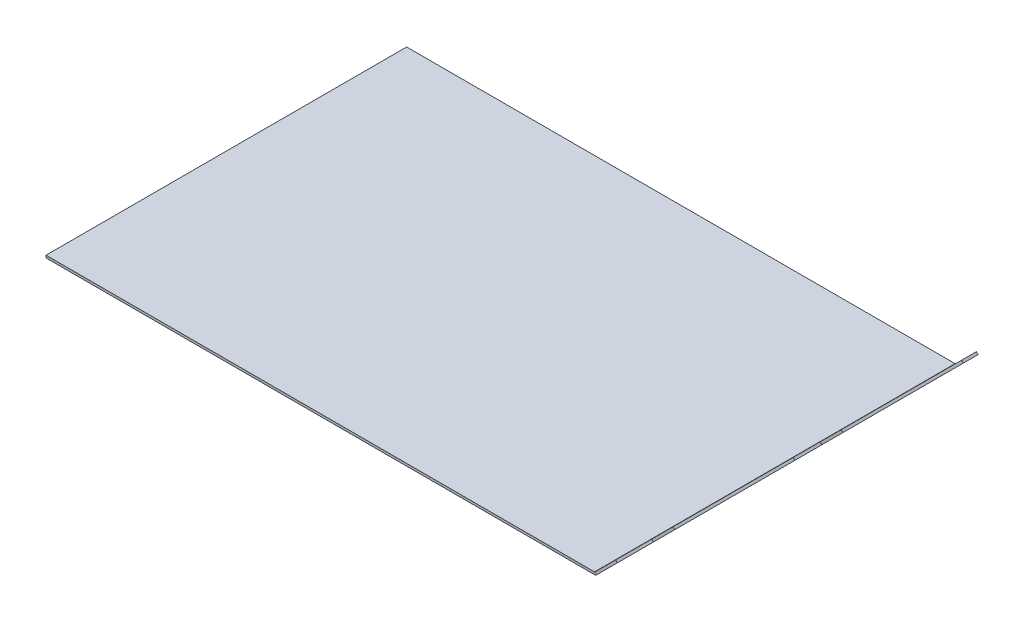
ISO-10303-21;
HEADER;
FILE_DESCRIPTION(('STEP AP214'),'2;1');
FILE_NAME('part.step','',(''),(''),'','','');
FILE_SCHEMA(('AUTOMOTIVE_DESIGN { 1 0 10303 214 1 1 1 1 }'));
ENDSEC;
DATA;
#1=APPLICATION_CONTEXT('core data for automotive mechanical design processes');
#2=APPLICATION_PROTOCOL_DEFINITION('international standard','automotive_design',2000,#1);
#3=PRODUCT_CONTEXT('',#1,'mechanical');
#4=PRODUCT('Part','Part','',(#3));
#5=PRODUCT_RELATED_PRODUCT_CATEGORY('part','',(#4));
#6=PRODUCT_DEFINITION_FORMATION('','',#4);
#7=PRODUCT_DEFINITION_CONTEXT('part definition',#1,'design');
#8=PRODUCT_DEFINITION('design','',#6,#7);
#9=PRODUCT_DEFINITION_SHAPE('','',#8);
#10=(LENGTH_UNIT() NAMED_UNIT(*) SI_UNIT(.MILLI.,.METRE.));
#11=(NAMED_UNIT(*) PLANE_ANGLE_UNIT() SI_UNIT($,.RADIAN.));
#12=(NAMED_UNIT(*) SI_UNIT($,.STERADIAN.) SOLID_ANGLE_UNIT());
#13=UNCERTAINTY_MEASURE_WITH_UNIT(LENGTH_MEASURE(1.E-05),#10,'distance_accuracy_value','');
#14=(GEOMETRIC_REPRESENTATION_CONTEXT(3) GLOBAL_UNCERTAINTY_ASSIGNED_CONTEXT((#13)) GLOBAL_UNIT_ASSIGNED_CONTEXT((#10,
#11,#12)) REPRESENTATION_CONTEXT('',''));
#15=CARTESIAN_POINT('',(0.,0.,0.));
#16=DIRECTION('',(0.,0.,1.));
#17=DIRECTION('',(1.,0.,0.));
#18=AXIS2_PLACEMENT_3D('',#15,#16,#17);
#19=CARTESIAN_POINT('',(239.55088437879,33.674651235032,-150.));
#20=DIRECTION('',(0.707106781186546,0.707106781186549,0.));
#21=DIRECTION('',(0.,0.,-1.));
#22=AXIS2_PLACEMENT_3D('',#19,#20,#21);
#23=PLANE('',#22);
#24=DIRECTION('',(-0.707106781186549,0.707106781186546,0.));
#25=VECTOR('',#24,1.);
#26=CARTESIAN_POINT('',(257.388209996306,15.837325617516,120.));
#27=LINE('',#26,#25);
#28=CARTESIAN_POINT('',(239.55088437879,33.674651235032,120.));
#29=VERTEX_POINT('',#28);
#30=CARTESIAN_POINT('',(238.136670816417,35.0888647974051,120.));
#31=VERTEX_POINT('',#30);
#32=EDGE_CURVE('E163',#29,#31,#27,.T.);
#33=ORIENTED_EDGE('',*,*,#32,.F.);
#34=DIRECTION('',(0.,0.,-1.));
#35=VECTOR('',#34,1.);
#36=CARTESIAN_POINT('',(239.55088437879,33.674651235032,-150.));
#37=LINE('',#36,#35);
#38=CARTESIAN_POINT('',(239.55088437879,33.674651235032,20.));
#39=VERTEX_POINT('',#38);
#40=EDGE_CURVE('E207',#29,#39,#37,.T.);
#41=ORIENTED_EDGE('',*,*,#40,.T.);
#42=DIRECTION('',(-0.707106781186549,0.707106781186546,0.));
#43=VECTOR('',#42,1.);
#44=CARTESIAN_POINT('',(257.388209996306,15.8373256175161,20.));
#45=LINE('',#44,#43);
#46=CARTESIAN_POINT('',(238.136670816417,35.0888647974051,20.));
#47=VERTEX_POINT('',#46);
#48=EDGE_CURVE('E248',#39,#47,#45,.T.);
#49=ORIENTED_EDGE('',*,*,#48,.T.);
#50=DIRECTION('',(0.,0.,-1.));
#51=VECTOR('',#50,1.);
#52=CARTESIAN_POINT('',(238.136670816417,35.0888647974051,-150.));
#53=LINE('',#52,#51);
#54=EDGE_CURVE('E180',#31,#47,#53,.T.);
#55=ORIENTED_EDGE('',*,*,#54,.F.);
#56=EDGE_LOOP('',(#33,#41,#49,#55));
#57=FACE_BOUND('',#56,.T.);
#58=ADVANCED_FACE('F43',(#57),#23,.T.);
#59=CARTESIAN_POINT('',(58.9383769540735,-144.109429064939,0.));
#60=DIRECTION('',(0.707106781186549,-0.707106781186546,0.));
#61=DIRECTION('',(0.,0.,-1.));
#62=AXIS2_PLACEMENT_3D('',#59,#60,#61);
#63=PLANE('',#62);
#64=DIRECTION('',(0.,0.,1.));
#65=VECTOR('',#64,1.);
#66=CARTESIAN_POINT('',(220.459001286754,17.4111952677413,150.));
#67=LINE('',#66,#65);
#68=CARTESIAN_POINT('',(220.459001286754,17.4111952677413,120.));
#69=VERTEX_POINT('',#68);
#70=CARTESIAN_POINT('',(220.459001286754,17.4111952677413,150.));
#71=VERTEX_POINT('',#70);
#72=EDGE_CURVE('E238',#69,#71,#67,.T.);
#73=ORIENTED_EDGE('',*,*,#72,.F.);
#74=DIRECTION('',(-0.707106781186547,-0.707106781186548,0.));
#75=VECTOR('',#74,1.);
#76=CARTESIAN_POINT('',(238.136670816417,35.0888647974051,120.));
#77=LINE('',#76,#75);
#78=EDGE_CURVE('E237',#31,#69,#77,.T.);
#79=ORIENTED_EDGE('',*,*,#78,.F.);
#80=ORIENTED_EDGE('',*,*,#54,.T.);
#81=DIRECTION('',(0.707106781186546,0.707106781186549,0.));
#82=VECTOR('',#81,1.);
#83=CARTESIAN_POINT('',(238.136670816417,35.0888647974051,20.));
#84=LINE('',#83,#82);
#85=CARTESIAN_POINT('',(220.459001286754,17.4111952677413,20.));
#86=VERTEX_POINT('',#85);
#87=EDGE_CURVE('E258',#86,#47,#84,.T.);
#88=ORIENTED_EDGE('',*,*,#87,.F.);
#89=DIRECTION('',(0.,0.,1.));
#90=VECTOR('',#89,1.);
#91=CARTESIAN_POINT('',(220.459001286754,17.4111952677413,-20.));
#92=LINE('',#91,#90);
#93=CARTESIAN_POINT('',(220.459001286754,17.4111952677413,-20.));
#94=VERTEX_POINT('',#93);
#95=EDGE_CURVE('E255',#94,#86,#92,.T.);
#96=ORIENTED_EDGE('',*,*,#95,.F.);
#97=DIRECTION('',(-0.707106781186546,-0.707106781186549,0.));
#98=VECTOR('',#97,1.);
#99=CARTESIAN_POINT('',(238.136670816417,35.0888647974051,-20.));
#100=LINE('',#99,#98);
#101=CARTESIAN_POINT('',(238.136670816417,35.0888647974051,-20.));
#102=VERTEX_POINT('',#101);
#103=EDGE_CURVE('E179',#102,#94,#100,.T.);
#104=ORIENTED_EDGE('',*,*,#103,.F.);
#105=CARTESIAN_POINT('',(238.136670816417,35.0888647974051,-120.));
#106=VERTEX_POINT('',#105);
#107=EDGE_CURVE('E170',#102,#106,#53,.T.);
#108=ORIENTED_EDGE('',*,*,#107,.T.);
#109=DIRECTION('',(0.707106781186546,0.707106781186549,0.));
#110=VECTOR('',#109,1.);
#111=CARTESIAN_POINT('',(238.136670816417,35.0888647974051,-120.));
#112=LINE('',#111,#110);
#113=CARTESIAN_POINT('',(220.459001286754,17.4111952677414,-120.));
#114=VERTEX_POINT('',#113);
#115=EDGE_CURVE('E154',#114,#106,#112,.T.);
#116=ORIENTED_EDGE('',*,*,#115,.F.);
#117=DIRECTION('',(0.,0.,1.));
#118=VECTOR('',#117,1.);
#119=CARTESIAN_POINT('',(220.459001286754,17.4111952677414,-150.));
#120=LINE('',#119,#118);
#121=CARTESIAN_POINT('',(220.459001286754,17.4111952677414,-150.));
#122=VERTEX_POINT('',#121);
#123=EDGE_CURVE('E162',#122,#114,#120,.T.);
#124=ORIENTED_EDGE('',*,*,#123,.F.);
#125=DIRECTION('',(-0.707106781186546,-0.707106781186549,0.));
#126=VECTOR('',#125,1.);
#127=CARTESIAN_POINT('',(238.136670816417,35.0888647974051,-150.));
#128=LINE('',#127,#126);
#129=CARTESIAN_POINT('',(203.26355116399,0.215745144978047,-150.));
#130=VERTEX_POINT('',#129);
#131=EDGE_CURVE('E184',#122,#130,#128,.T.);
#132=ORIENTED_EDGE('',*,*,#131,.T.);
#133=DIRECTION('',(0.,0.,1.));
#134=VECTOR('',#133,1.);
#135=CARTESIAN_POINT('',(203.26355116399,0.215745144978019,0.));
#136=LINE('',#135,#134);
#137=CARTESIAN_POINT('',(203.26355116399,0.215745144977991,150.));
#138=VERTEX_POINT('',#137);
#139=EDGE_CURVE('E198',#130,#138,#136,.T.);
#140=ORIENTED_EDGE('',*,*,#139,.T.);
#141=DIRECTION('',(0.707106781186546,0.707106781186549,0.));
#142=VECTOR('',#141,1.);
#143=CARTESIAN_POINT('',(238.136670816417,35.0888647974051,150.));
#144=LINE('',#143,#142);
#145=EDGE_CURVE('E208',#138,#71,#144,.T.);
#146=ORIENTED_EDGE('',*,*,#145,.T.);
#147=EDGE_LOOP('',(#73,#79,#80,#88,#96,#104,#108,#116,#124,#132,#140,#146));
#148=FACE_BOUND('',#147,.T.);
#149=ADVANCED_FACE('F177',(#148),#63,.F.);
#150=DIRECTION('',(-0.707106781186549,0.707106781186546,0.));
#151=VECTOR('',#150,1.);
#152=CARTESIAN_POINT('',(257.388209996306,15.8373256175161,-120.));
#153=LINE('',#152,#151);
#154=CARTESIAN_POINT('',(239.55088437879,33.674651235032,-120.));
#155=VERTEX_POINT('',#154);
#156=EDGE_CURVE('E157',#155,#106,#153,.T.);
#157=ORIENTED_EDGE('',*,*,#156,.T.);
#158=ORIENTED_EDGE('',*,*,#107,.F.);
#159=DIRECTION('',(-0.707106781186549,0.707106781186546,0.));
#160=VECTOR('',#159,1.);
#161=CARTESIAN_POINT('',(257.388209996306,15.8373256175161,-20.));
#162=LINE('',#161,#160);
#163=CARTESIAN_POINT('',(239.55088437879,33.674651235032,-20.));
#164=VERTEX_POINT('',#163);
#165=EDGE_CURVE('E260',#164,#102,#162,.T.);
#166=ORIENTED_EDGE('',*,*,#165,.F.);
#167=EDGE_CURVE('E172',#164,#155,#37,.T.);
#168=ORIENTED_EDGE('',*,*,#167,.T.);
#169=EDGE_LOOP('',(#157,#158,#166,#168));
#170=FACE_BOUND('',#169,.T.);
#171=ADVANCED_FACE('F168',(#170),#23,.T.);
#172=CARTESIAN_POINT('',(239.55088437879,33.674651235032,150.));
#173=DIRECTION('',(0.,0.,1.));
#174=DIRECTION('',(0.707106781186546,0.707106781186549,0.));
#175=AXIS2_PLACEMENT_3D('',#172,#173,#174);
#176=PLANE('',#175);
#177=DIRECTION('',(-0.707106781186549,0.707106781186546,0.));
#178=VECTOR('',#177,1.);
#179=CARTESIAN_POINT('',(239.710540466643,-1.84034391214773,150.));
#180=LINE('',#179,#178);
#181=CARTESIAN_POINT('',(221.873214849127,15.9969817053682,150.));
#182=VERTEX_POINT('',#181);
#183=EDGE_CURVE('E229',#182,#71,#180,.T.);
#184=ORIENTED_EDGE('',*,*,#183,.T.);
#185=ORIENTED_EDGE('',*,*,#145,.F.);
#186=DIRECTION('',(-0.707106781186549,0.707106781186546,0.));
#187=VECTOR('',#186,1.);
#188=CARTESIAN_POINT('',(204.677764726363,-1.19846841739507,150.));
#189=LINE('',#188,#187);
#190=CARTESIAN_POINT('',(204.677764726363,-1.19846841739514,150.));
#191=VERTEX_POINT('',#190);
#192=EDGE_CURVE('E194',#191,#138,#189,.T.);
#193=ORIENTED_EDGE('',*,*,#192,.F.);
#194=DIRECTION('',(0.707106781186546,0.707106781186549,0.));
#195=VECTOR('',#194,1.);
#196=CARTESIAN_POINT('',(239.55088437879,33.674651235032,150.));
#197=LINE('',#196,#195);
#198=EDGE_CURVE('E195',#191,#182,#197,.T.);
#199=ORIENTED_EDGE('',*,*,#198,.T.);
#200=EDGE_LOOP('',(#184,#185,#193,#199));
#201=FACE_BOUND('',#200,.T.);
#202=ADVANCED_FACE('F340',(#201),#176,.T.);
#203=CARTESIAN_POINT('',(239.55088437879,33.674651235032,-150.));
#204=DIRECTION('',(0.,0.,-1.));
#205=DIRECTION('',(-0.707106781186546,-0.707106781186549,0.));
#206=AXIS2_PLACEMENT_3D('',#203,#204,#205);
#207=PLANE('',#206);
#208=DIRECTION('',(-0.707106781186549,0.707106781186546,0.));
#209=VECTOR('',#208,1.);
#210=CARTESIAN_POINT('',(239.710540466643,-1.84034391214767,-150.));
#211=LINE('',#210,#209);
#212=CARTESIAN_POINT('',(221.873214849127,15.9969817053683,-150.));
#213=VERTEX_POINT('',#212);
#214=EDGE_CURVE('E173',#213,#122,#211,.T.);
#215=ORIENTED_EDGE('',*,*,#214,.F.);
#216=DIRECTION('',(-0.707106781186546,-0.707106781186549,0.));
#217=VECTOR('',#216,1.);
#218=CARTESIAN_POINT('',(239.55088437879,33.674651235032,-150.));
#219=LINE('',#218,#217);
#220=CARTESIAN_POINT('',(204.677764726363,-1.19846841739504,-150.));
#221=VERTEX_POINT('',#220);
#222=EDGE_CURVE('E205',#213,#221,#219,.T.);
#223=ORIENTED_EDGE('',*,*,#222,.T.);
#224=DIRECTION('',(0.707106781186549,-0.707106781186546,0.));
#225=VECTOR('',#224,1.);
#226=CARTESIAN_POINT('',(204.677764726363,-1.19846841739507,-150.));
#227=LINE('',#226,#225);
#228=EDGE_CURVE('E201',#130,#221,#227,.T.);
#229=ORIENTED_EDGE('',*,*,#228,.F.);
#230=ORIENTED_EDGE('',*,*,#131,.F.);
#231=EDGE_LOOP('',(#215,#223,#229,#230));
#232=FACE_BOUND('',#231,.T.);
#233=ADVANCED_FACE('F45',(#232),#207,.T.);
#234=CARTESIAN_POINT('',(60.3525905164466,-145.523642627312,0.));
#235=DIRECTION('',(0.707106781186549,-0.707106781186546,0.));
#236=DIRECTION('',(0.,0.,-1.));
#237=AXIS2_PLACEMENT_3D('',#234,#235,#236);
#238=PLANE('',#237);
#239=DIRECTION('',(0.707106781186546,0.707106781186549,0.));
#240=VECTOR('',#239,1.);
#241=CARTESIAN_POINT('',(60.3525905164467,-145.523642627312,120.));
#242=LINE('',#241,#240);
#243=CARTESIAN_POINT('',(221.873214849127,15.9969817053682,120.));
#244=VERTEX_POINT('',#243);
#245=EDGE_CURVE('E12',#244,#29,#242,.T.);
#246=ORIENTED_EDGE('',*,*,#245,.F.);
#247=DIRECTION('',(0.,0.,-1.));
#248=VECTOR('',#247,1.);
#249=CARTESIAN_POINT('',(221.873214849127,15.9969817053683,0.));
#250=LINE('',#249,#248);
#251=EDGE_CURVE('E51',#182,#244,#250,.T.);
#252=ORIENTED_EDGE('',*,*,#251,.F.);
#253=ORIENTED_EDGE('',*,*,#198,.F.);
#254=DIRECTION('',(0.,0.,1.));
#255=VECTOR('',#254,1.);
#256=CARTESIAN_POINT('',(204.677764726363,-1.19846841739507,0.));
#257=LINE('',#256,#255);
#258=EDGE_CURVE('E191',#221,#191,#257,.T.);
#259=ORIENTED_EDGE('',*,*,#258,.F.);
#260=ORIENTED_EDGE('',*,*,#222,.F.);
#261=DIRECTION('',(0.,0.,-1.));
#262=VECTOR('',#261,1.);
#263=CARTESIAN_POINT('',(221.873214849127,15.9969817053683,0.));
#264=LINE('',#263,#262);
#265=CARTESIAN_POINT('',(221.873214849127,15.9969817053683,-120.));
#266=VERTEX_POINT('',#265);
#267=EDGE_CURVE('E219',#266,#213,#264,.T.);
#268=ORIENTED_EDGE('',*,*,#267,.F.);
#269=DIRECTION('',(-0.707106781186546,-0.707106781186549,0.));
#270=VECTOR('',#269,1.);
#271=CARTESIAN_POINT('',(60.3525905164467,-145.523642627312,-120.));
#272=LINE('',#271,#270);
#273=EDGE_CURVE('E221',#155,#266,#272,.T.);
#274=ORIENTED_EDGE('',*,*,#273,.F.);
#275=ORIENTED_EDGE('',*,*,#167,.F.);
#276=DIRECTION('',(0.707106781186546,0.707106781186549,0.));
#277=VECTOR('',#276,1.);
#278=CARTESIAN_POINT('',(60.3525905164466,-145.523642627312,-20.));
#279=LINE('',#278,#277);
#280=CARTESIAN_POINT('',(221.873214849127,15.9969817053683,-20.));
#281=VERTEX_POINT('',#280);
#282=EDGE_CURVE('E204',#281,#164,#279,.T.);
#283=ORIENTED_EDGE('',*,*,#282,.F.);
#284=DIRECTION('',(0.,0.,-1.));
#285=VECTOR('',#284,1.);
#286=CARTESIAN_POINT('',(221.873214849127,15.9969817053683,0.));
#287=LINE('',#286,#285);
#288=CARTESIAN_POINT('',(221.873214849127,15.9969817053683,20.));
#289=VERTEX_POINT('',#288);
#290=EDGE_CURVE('E215',#289,#281,#287,.T.);
#291=ORIENTED_EDGE('',*,*,#290,.F.);
#292=DIRECTION('',(-0.707106781186546,-0.707106781186549,0.));
#293=VECTOR('',#292,1.);
#294=CARTESIAN_POINT('',(60.3525905164466,-145.523642627312,19.9999999999999));
#295=LINE('',#294,#293);
#296=EDGE_CURVE('E217',#39,#289,#295,.T.);
#297=ORIENTED_EDGE('',*,*,#296,.F.);
#298=ORIENTED_EDGE('',*,*,#40,.F.);
#299=EDGE_LOOP('',(#246,#252,#253,#259,#260,#268,#274,#275,#283,#291,#297,#298));
#300=FACE_BOUND('',#299,.T.);
#301=ADVANCED_FACE('F241',(#300),#238,.T.);
#302=CARTESIAN_POINT('',(-253.424657534247,-2.,-150.));
#303=DIRECTION('',(-1.,0.,0.));
#304=DIRECTION('',(0.,0.,1.));
#305=AXIS2_PLACEMENT_3D('',#302,#303,#304);
#306=PLANE('',#305);
#307=DIRECTION('',(0.,0.,1.));
#308=VECTOR('',#307,1.);
#309=CARTESIAN_POINT('',(-253.424657534247,0.,-150.));
#310=LINE('',#309,#308);
#311=CARTESIAN_POINT('',(-253.424657534247,0.,-150.));
#312=VERTEX_POINT('',#311);
#313=CARTESIAN_POINT('',(-253.424657534247,0.,150.));
#314=VERTEX_POINT('',#313);
#315=EDGE_CURVE('E285',#312,#314,#310,.T.);
#316=ORIENTED_EDGE('',*,*,#315,.F.);
#317=DIRECTION('',(0.,1.,0.));
#318=VECTOR('',#317,1.);
#319=CARTESIAN_POINT('',(-253.424657534247,-2.,-150.));
#320=LINE('',#319,#318);
#321=CARTESIAN_POINT('',(-253.424657534247,-2.,-150.));
#322=VERTEX_POINT('',#321);
#323=EDGE_CURVE('E181',#322,#312,#320,.T.);
#324=ORIENTED_EDGE('',*,*,#323,.F.);
#325=DIRECTION('',(0.,0.,1.));
#326=VECTOR('',#325,1.);
#327=CARTESIAN_POINT('',(-253.424657534247,-2.,-150.));
#328=LINE('',#327,#326);
#329=CARTESIAN_POINT('',(-253.424657534247,-2.,150.));
#330=VERTEX_POINT('',#329);
#331=EDGE_CURVE('E301',#322,#330,#328,.T.);
#332=ORIENTED_EDGE('',*,*,#331,.T.);
#333=DIRECTION('',(0.,1.,0.));
#334=VECTOR('',#333,1.);
#335=CARTESIAN_POINT('',(-253.424657534247,-2.,150.));
#336=LINE('',#335,#334);
#337=EDGE_CURVE('E299',#330,#314,#336,.T.);
#338=ORIENTED_EDGE('',*,*,#337,.T.);
#339=EDGE_LOOP('',(#316,#324,#332,#338));
#340=FACE_BOUND('',#339,.T.);
#341=ADVANCED_FACE('F379',(#340),#306,.T.);
#342=CARTESIAN_POINT('',(0.,-2.,0.));
#343=DIRECTION('',(0.,-1.,0.));
#344=DIRECTION('',(0.,0.,-1.));
#345=AXIS2_PLACEMENT_3D('',#342,#343,#344);
#346=PLANE('',#345);
#347=DIRECTION('',(-1.,0.,0.));
#348=VECTOR('',#347,1.);
#349=CARTESIAN_POINT('',(253.424657534246,-2.,-150.));
#350=LINE('',#349,#348);
#351=CARTESIAN_POINT('',(202.742696308968,-2.,-150.));
#352=VERTEX_POINT('',#351);
#353=EDGE_CURVE('E186',#352,#322,#350,.T.);
#354=ORIENTED_EDGE('',*,*,#353,.F.);
#355=DIRECTION('',(0.,0.,1.));
#356=VECTOR('',#355,1.);
#357=CARTESIAN_POINT('',(202.742696308968,-2.,0.));
#358=LINE('',#357,#356);
#359=CARTESIAN_POINT('',(202.742696308968,-2.,150.));
#360=VERTEX_POINT('',#359);
#361=EDGE_CURVE('E296',#352,#360,#358,.T.);
#362=ORIENTED_EDGE('',*,*,#361,.T.);
#363=DIRECTION('',(1.,0.,0.));
#364=VECTOR('',#363,1.);
#365=CARTESIAN_POINT('',(253.424657534246,-2.,150.));
#366=LINE('',#365,#364);
#367=EDGE_CURVE('E293',#330,#360,#366,.T.);
#368=ORIENTED_EDGE('',*,*,#367,.F.);
#369=ORIENTED_EDGE('',*,*,#331,.F.);
#370=EDGE_LOOP('',(#354,#362,#368,#369));
#371=FACE_BOUND('',#370,.T.);
#372=ADVANCED_FACE('F327',(#371),#346,.T.);
#373=CARTESIAN_POINT('',(253.424657534246,-2.,150.));
#374=DIRECTION('',(0.,0.,1.));
#375=DIRECTION('',(1.,0.,0.));
#376=AXIS2_PLACEMENT_3D('',#373,#374,#375);
#377=PLANE('',#376);
#378=ORIENTED_EDGE('',*,*,#367,.T.);
#379=DIRECTION('',(0.,1.,0.));
#380=VECTOR('',#379,1.);
#381=CARTESIAN_POINT('',(202.742696308968,-2.,150.));
#382=LINE('',#381,#380);
#383=CARTESIAN_POINT('',(202.742696308968,0.,150.));
#384=VERTEX_POINT('',#383);
#385=EDGE_CURVE('E290',#360,#384,#382,.T.);
#386=ORIENTED_EDGE('',*,*,#385,.T.);
#387=DIRECTION('',(1.,0.,0.));
#388=VECTOR('',#387,1.);
#389=CARTESIAN_POINT('',(253.424657534246,0.,150.));
#390=LINE('',#389,#388);
#391=EDGE_CURVE('E282',#314,#384,#390,.T.);
#392=ORIENTED_EDGE('',*,*,#391,.F.);
#393=ORIENTED_EDGE('',*,*,#337,.F.);
#394=EDGE_LOOP('',(#378,#386,#392,#393));
#395=FACE_BOUND('',#394,.T.);
#396=ADVANCED_FACE('F316',(#395),#377,.T.);
#397=CARTESIAN_POINT('',(0.,0.,0.));
#398=DIRECTION('',(0.,-1.,0.));
#399=DIRECTION('',(0.,0.,-1.));
#400=AXIS2_PLACEMENT_3D('',#397,#398,#399);
#401=PLANE('',#400);
#402=DIRECTION('',(0.,0.,1.));
#403=VECTOR('',#402,1.);
#404=CARTESIAN_POINT('',(202.742696308968,0.,0.));
#405=LINE('',#404,#403);
#406=CARTESIAN_POINT('',(202.742696308968,0.,-150.));
#407=VERTEX_POINT('',#406);
#408=EDGE_CURVE('E274',#407,#384,#405,.T.);
#409=ORIENTED_EDGE('',*,*,#408,.F.);
#410=DIRECTION('',(-1.,0.,0.));
#411=VECTOR('',#410,1.);
#412=CARTESIAN_POINT('',(253.424657534246,0.,-150.));
#413=LINE('',#412,#411);
#414=EDGE_CURVE('E288',#407,#312,#413,.T.);
#415=ORIENTED_EDGE('',*,*,#414,.T.);
#416=ORIENTED_EDGE('',*,*,#315,.T.);
#417=ORIENTED_EDGE('',*,*,#391,.T.);
#418=EDGE_LOOP('',(#409,#415,#416,#417));
#419=FACE_BOUND('',#418,.T.);
#420=ADVANCED_FACE('F313',(#419),#401,.F.);
#421=CARTESIAN_POINT('',(253.424657534246,-2.,-150.));
#422=DIRECTION('',(0.,0.,-1.));
#423=DIRECTION('',(-1.,0.,0.));
#424=AXIS2_PLACEMENT_3D('',#421,#422,#423);
#425=PLANE('',#424);
#426=ORIENTED_EDGE('',*,*,#414,.F.);
#427=DIRECTION('',(0.,-1.,0.));
#428=VECTOR('',#427,1.);
#429=CARTESIAN_POINT('',(202.742696308968,-2.,-150.));
#430=LINE('',#429,#428);
#431=EDGE_CURVE('E279',#407,#352,#430,.T.);
#432=ORIENTED_EDGE('',*,*,#431,.T.);
#433=ORIENTED_EDGE('',*,*,#353,.T.);
#434=ORIENTED_EDGE('',*,*,#323,.T.);
#435=EDGE_LOOP('',(#426,#432,#433,#434));
#436=FACE_BOUND('',#435,.T.);
#437=ADVANCED_FACE('F331',(#436),#425,.T.);
#438=CARTESIAN_POINT('',(202.742696308968,0.7366,-150.));
#439=DIRECTION('',(0.,0.,-1.));
#440=DIRECTION('',(-1.,0.,0.));
#441=AXIS2_PLACEMENT_3D('',#438,#439,#440);
#442=PLANE('',#441);
#443=ORIENTED_EDGE('',*,*,#431,.F.);
#444=CARTESIAN_POINT('',(202.742696308968,0.7366,-150.));
#445=DIRECTION('',(0.,0.,1.));
#446=DIRECTION('',(1.,0.,0.));
#447=AXIS2_PLACEMENT_3D('',#444,#445,#446);
#448=CIRCLE('',#447,0.7366);
#449=EDGE_CURVE('E262',#407,#130,#448,.T.);
#450=ORIENTED_EDGE('',*,*,#449,.T.);
#451=ORIENTED_EDGE('',*,*,#228,.T.);
#452=CARTESIAN_POINT('',(202.742696308968,0.7366,-150.));
#453=DIRECTION('',(0.,0.,1.));
#454=DIRECTION('',(-1.,0.,0.));
#455=AXIS2_PLACEMENT_3D('',#452,#453,#454);
#456=CIRCLE('',#455,2.7366);
#457=EDGE_CURVE('E267',#352,#221,#456,.T.);
#458=ORIENTED_EDGE('',*,*,#457,.F.);
#459=EDGE_LOOP('',(#443,#450,#451,#458));
#460=FACE_BOUND('',#459,.T.);
#461=ADVANCED_FACE('F333',(#460),#442,.T.);
#462=CARTESIAN_POINT('',(202.742696308968,0.7366,150.));
#463=DIRECTION('',(0.,0.,1.));
#464=DIRECTION('',(1.,0.,0.));
#465=AXIS2_PLACEMENT_3D('',#462,#463,#464);
#466=PLANE('',#465);
#467=CARTESIAN_POINT('',(202.742696308968,0.7366,150.));
#468=DIRECTION('',(0.,0.,1.));
#469=DIRECTION('',(1.,0.,0.));
#470=AXIS2_PLACEMENT_3D('',#467,#468,#469);
#471=CIRCLE('',#470,0.7366);
#472=EDGE_CURVE('E271',#138,#384,#471,.F.);
#473=ORIENTED_EDGE('',*,*,#472,.T.);
#474=ORIENTED_EDGE('',*,*,#385,.F.);
#475=CARTESIAN_POINT('',(202.742696308968,0.7366,150.));
#476=DIRECTION('',(0.,0.,-1.));
#477=DIRECTION('',(1.,0.,0.));
#478=AXIS2_PLACEMENT_3D('',#475,#476,#477);
#479=CIRCLE('',#478,2.7366);
#480=EDGE_CURVE('E270',#191,#360,#479,.T.);
#481=ORIENTED_EDGE('',*,*,#480,.F.);
#482=ORIENTED_EDGE('',*,*,#192,.T.);
#483=EDGE_LOOP('',(#473,#474,#481,#482));
#484=FACE_BOUND('',#483,.T.);
#485=ADVANCED_FACE('F320',(#484),#466,.T.);
#486=CARTESIAN_POINT('',(202.742696308968,0.7366,-300.009766981762));
#487=DIRECTION('',(0.,0.,1.));
#488=DIRECTION('',(1.,0.,0.));
#489=AXIS2_PLACEMENT_3D('',#486,#487,#488);
#490=CYLINDRICAL_SURFACE('',#489,2.7366);
#491=ORIENTED_EDGE('',*,*,#258,.T.);
#492=ORIENTED_EDGE('',*,*,#480,.T.);
#493=ORIENTED_EDGE('',*,*,#361,.F.);
#494=ORIENTED_EDGE('',*,*,#457,.T.);
#495=EDGE_LOOP('',(#491,#492,#493,#494));
#496=FACE_BOUND('',#495,.T.);
#497=ADVANCED_FACE('F322',(#496),#490,.T.);
#498=CARTESIAN_POINT('',(202.742696308968,0.7366,-300.009766981762));
#499=DIRECTION('',(0.,0.,1.));
#500=DIRECTION('',(1.,0.,0.));
#501=AXIS2_PLACEMENT_3D('',#498,#499,#500);
#502=CYLINDRICAL_SURFACE('',#501,0.7366);
#503=ORIENTED_EDGE('',*,*,#139,.F.);
#504=ORIENTED_EDGE('',*,*,#449,.F.);
#505=ORIENTED_EDGE('',*,*,#408,.T.);
#506=ORIENTED_EDGE('',*,*,#472,.F.);
#507=EDGE_LOOP('',(#503,#504,#505,#506));
#508=FACE_BOUND('',#507,.T.);
#509=ADVANCED_FACE('F309',(#508),#502,.F.);
#510=CARTESIAN_POINT('',(257.388209996306,15.8373256175161,20.));
#511=DIRECTION('',(0.,0.,1.));
#512=DIRECTION('',(0.,-1.,0.));
#513=AXIS2_PLACEMENT_3D('',#510,#511,#512);
#514=PLANE('',#513);
#515=ORIENTED_EDGE('',*,*,#296,.T.);
#516=DIRECTION('',(-0.707106781186549,0.707106781186546,0.));
#517=VECTOR('',#516,1.);
#518=CARTESIAN_POINT('',(239.710540466643,-1.8403439121477,20.));
#519=LINE('',#518,#517);
#520=EDGE_CURVE('E263',#289,#86,#519,.T.);
#521=ORIENTED_EDGE('',*,*,#520,.T.);
#522=ORIENTED_EDGE('',*,*,#87,.T.);
#523=ORIENTED_EDGE('',*,*,#48,.F.);
#524=EDGE_LOOP('',(#515,#521,#522,#523));
#525=FACE_BOUND('',#524,.T.);
#526=ADVANCED_FACE('F348',(#525),#514,.F.);
#527=CARTESIAN_POINT('',(239.710540466643,-1.8403439121477,-20.));
#528=DIRECTION('',(-0.707106781186546,-0.707106781186549,0.));
#529=DIRECTION('',(0.707106781186549,-0.707106781186546,0.));
#530=AXIS2_PLACEMENT_3D('',#527,#528,#529);
#531=PLANE('',#530);
#532=ORIENTED_EDGE('',*,*,#290,.T.);
#533=DIRECTION('',(-0.707106781186549,0.707106781186546,0.));
#534=VECTOR('',#533,1.);
#535=CARTESIAN_POINT('',(239.710540466643,-1.8403439121477,-20.));
#536=LINE('',#535,#534);
#537=EDGE_CURVE('E66',#281,#94,#536,.T.);
#538=ORIENTED_EDGE('',*,*,#537,.T.);
#539=ORIENTED_EDGE('',*,*,#95,.T.);
#540=ORIENTED_EDGE('',*,*,#520,.F.);
#541=EDGE_LOOP('',(#532,#538,#539,#540));
#542=FACE_BOUND('',#541,.T.);
#543=ADVANCED_FACE('F351',(#542),#531,.F.);
#544=CARTESIAN_POINT('',(257.388209996306,15.8373256175161,-20.));
#545=DIRECTION('',(0.,0.,-1.));
#546=DIRECTION('',(-1.,0.,0.));
#547=AXIS2_PLACEMENT_3D('',#544,#545,#546);
#548=PLANE('',#547);
#549=ORIENTED_EDGE('',*,*,#282,.T.);
#550=ORIENTED_EDGE('',*,*,#165,.T.);
#551=ORIENTED_EDGE('',*,*,#103,.T.);
#552=ORIENTED_EDGE('',*,*,#537,.F.);
#553=EDGE_LOOP('',(#549,#550,#551,#552));
#554=FACE_BOUND('',#553,.T.);
#555=ADVANCED_FACE('F353',(#554),#548,.F.);
#556=CARTESIAN_POINT('',(257.388209996306,15.8373256175161,-120.));
#557=DIRECTION('',(0.,0.,1.));
#558=DIRECTION('',(0.,-1.,0.));
#559=AXIS2_PLACEMENT_3D('',#556,#557,#558);
#560=PLANE('',#559);
#561=ORIENTED_EDGE('',*,*,#273,.T.);
#562=DIRECTION('',(-0.707106781186549,0.707106781186546,0.));
#563=VECTOR('',#562,1.);
#564=CARTESIAN_POINT('',(239.710540466643,-1.84034391214769,-120.));
#565=LINE('',#564,#563);
#566=EDGE_CURVE('E58',#266,#114,#565,.T.);
#567=ORIENTED_EDGE('',*,*,#566,.T.);
#568=ORIENTED_EDGE('',*,*,#115,.T.);
#569=ORIENTED_EDGE('',*,*,#156,.F.);
#570=EDGE_LOOP('',(#561,#567,#568,#569));
#571=FACE_BOUND('',#570,.T.);
#572=ADVANCED_FACE('F156',(#571),#560,.F.);
#573=CARTESIAN_POINT('',(239.710540466643,-1.84034391214767,-150.));
#574=DIRECTION('',(-0.707106781186546,-0.707106781186549,0.));
#575=DIRECTION('',(0.707106781186549,-0.707106781186546,0.));
#576=AXIS2_PLACEMENT_3D('',#573,#574,#575);
#577=PLANE('',#576);
#578=ORIENTED_EDGE('',*,*,#267,.T.);
#579=ORIENTED_EDGE('',*,*,#214,.T.);
#580=ORIENTED_EDGE('',*,*,#123,.T.);
#581=ORIENTED_EDGE('',*,*,#566,.F.);
#582=EDGE_LOOP('',(#578,#579,#580,#581));
#583=FACE_BOUND('',#582,.T.);
#584=ADVANCED_FACE('F342',(#583),#577,.F.);
#585=CARTESIAN_POINT('',(257.388209996306,15.837325617516,120.));
#586=DIRECTION('',(0.,0.,-1.));
#587=DIRECTION('',(-1.,0.,0.));
#588=AXIS2_PLACEMENT_3D('',#585,#586,#587);
#589=PLANE('',#588);
#590=ORIENTED_EDGE('',*,*,#245,.T.);
#591=ORIENTED_EDGE('',*,*,#32,.T.);
#592=ORIENTED_EDGE('',*,*,#78,.T.);
#593=DIRECTION('',(-0.707106781186549,0.707106781186546,0.));
#594=VECTOR('',#593,1.);
#595=CARTESIAN_POINT('',(239.710540466643,-1.84034391214771,120.));
#596=LINE('',#595,#594);
#597=EDGE_CURVE('E226',#244,#69,#596,.T.);
#598=ORIENTED_EDGE('',*,*,#597,.F.);
#599=EDGE_LOOP('',(#590,#591,#592,#598));
#600=FACE_BOUND('',#599,.T.);
#601=ADVANCED_FACE('F234',(#600),#589,.F.);
#602=CARTESIAN_POINT('',(239.710540466643,-1.84034391214773,150.));
#603=DIRECTION('',(-0.707106781186546,-0.707106781186549,0.));
#604=DIRECTION('',(0.707106781186549,-0.707106781186546,0.));
#605=AXIS2_PLACEMENT_3D('',#602,#603,#604);
#606=PLANE('',#605);
#607=ORIENTED_EDGE('',*,*,#251,.T.);
#608=ORIENTED_EDGE('',*,*,#597,.T.);
#609=ORIENTED_EDGE('',*,*,#72,.T.);
#610=ORIENTED_EDGE('',*,*,#183,.F.);
#611=EDGE_LOOP('',(#607,#608,#609,#610));
#612=FACE_BOUND('',#611,.T.);
#613=ADVANCED_FACE('F225',(#612),#606,.F.);
#614=CLOSED_SHELL('',(#58,#149,#171,#202,#233,#301,#341,#372,#396,#420,#437,#461,#485,#497,#509,
#526,#543,#555,#572,#584,#601,#613));
#615=MANIFOLD_SOLID_BREP('B2',#614);
#616=ADVANCED_BREP_SHAPE_REPRESENTATION('',(#18,#615),#14);
#617=SHAPE_DEFINITION_REPRESENTATION(#9,#616);
ENDSEC;
END-ISO-10303-21;
